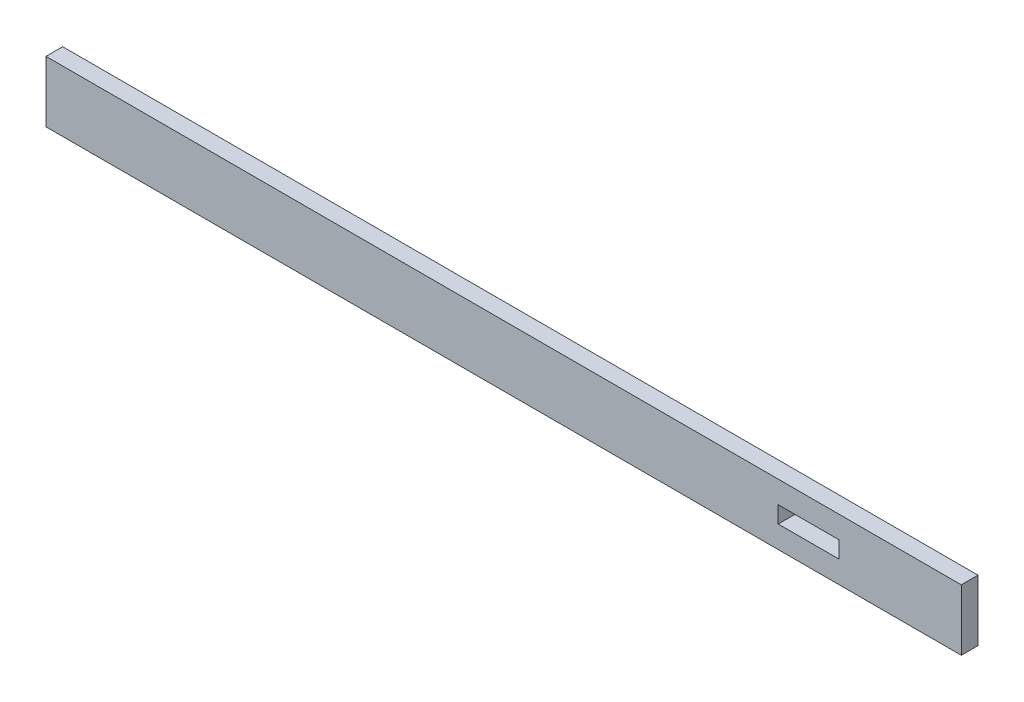
ISO-10303-21;
HEADER;
FILE_DESCRIPTION(('STEP AP214'),'2;1');
FILE_NAME('part.step','',(''),(''),'','','');
FILE_SCHEMA(('AUTOMOTIVE_DESIGN { 1 0 10303 214 1 1 1 1 }'));
ENDSEC;
DATA;
#1=APPLICATION_CONTEXT('core data for automotive mechanical design processes');
#2=APPLICATION_PROTOCOL_DEFINITION('international standard','automotive_design',2000,#1);
#3=PRODUCT_CONTEXT('',#1,'mechanical');
#4=PRODUCT('Part','Part','',(#3));
#5=PRODUCT_RELATED_PRODUCT_CATEGORY('part','',(#4));
#6=PRODUCT_DEFINITION_FORMATION('','',#4);
#7=PRODUCT_DEFINITION_CONTEXT('part definition',#1,'design');
#8=PRODUCT_DEFINITION('design','',#6,#7);
#9=PRODUCT_DEFINITION_SHAPE('','',#8);
#10=(LENGTH_UNIT() NAMED_UNIT(*) SI_UNIT(.MILLI.,.METRE.));
#11=(NAMED_UNIT(*) PLANE_ANGLE_UNIT() SI_UNIT($,.RADIAN.));
#12=(NAMED_UNIT(*) SI_UNIT($,.STERADIAN.) SOLID_ANGLE_UNIT());
#13=UNCERTAINTY_MEASURE_WITH_UNIT(LENGTH_MEASURE(1.E-05),#10,'distance_accuracy_value','');
#14=(GEOMETRIC_REPRESENTATION_CONTEXT(3) GLOBAL_UNCERTAINTY_ASSIGNED_CONTEXT((#13)) GLOBAL_UNIT_ASSIGNED_CONTEXT((#10,
#11,#12)) REPRESENTATION_CONTEXT('',''));
#15=CARTESIAN_POINT('',(0.,0.,0.));
#16=DIRECTION('',(0.,0.,1.));
#17=DIRECTION('',(1.,0.,0.));
#18=AXIS2_PLACEMENT_3D('',#15,#16,#17);
#19=CARTESIAN_POINT('',(0.,0.,2.74));
#20=DIRECTION('',(0.,0.,-1.));
#21=DIRECTION('',(-1.,0.,0.));
#22=AXIS2_PLACEMENT_3D('',#19,#20,#21);
#23=PLANE('',#22);
#24=DIRECTION('',(1.,0.,0.));
#25=VECTOR('',#24,1.);
#26=CARTESIAN_POINT('',(0.,0.,2.74));
#27=LINE('',#26,#25);
#28=CARTESIAN_POINT('',(-150.,0.,2.74));
#29=VERTEX_POINT('',#28);
#30=CARTESIAN_POINT('',(0.,0.,2.74));
#31=VERTEX_POINT('',#30);
#32=EDGE_CURVE('E140',#29,#31,#27,.T.);
#33=ORIENTED_EDGE('',*,*,#32,.T.);
#34=DIRECTION('',(0.,1.,0.));
#35=VECTOR('',#34,1.);
#36=CARTESIAN_POINT('',(0.,0.,2.74));
#37=LINE('',#36,#35);
#38=CARTESIAN_POINT('',(0.,10.,2.74));
#39=VERTEX_POINT('',#38);
#40=EDGE_CURVE('E141',#31,#39,#37,.T.);
#41=ORIENTED_EDGE('',*,*,#40,.T.);
#42=DIRECTION('',(-1.,0.,0.));
#43=VECTOR('',#42,1.);
#44=CARTESIAN_POINT('',(0.,10.,2.74));
#45=LINE('',#44,#43);
#46=CARTESIAN_POINT('',(-150.,9.99999999999996,2.74));
#47=VERTEX_POINT('',#46);
#48=EDGE_CURVE('E148',#39,#47,#45,.T.);
#49=ORIENTED_EDGE('',*,*,#48,.T.);
#50=DIRECTION('',(0.,-1.,0.));
#51=VECTOR('',#50,1.);
#52=CARTESIAN_POINT('',(-150.,0.,2.74));
#53=LINE('',#52,#51);
#54=EDGE_CURVE('E146',#47,#29,#53,.T.);
#55=ORIENTED_EDGE('',*,*,#54,.T.);
#56=EDGE_LOOP('',(#33,#41,#49,#55));
#57=FACE_BOUND('',#56,.T.);
#58=DIRECTION('',(-1.,0.,0.));
#59=VECTOR('',#58,1.);
#60=CARTESIAN_POINT('',(-30.,6.36999999999999,2.74));
#61=LINE('',#60,#59);
#62=CARTESIAN_POINT('',(-20.,6.36999999999999,2.74));
#63=VERTEX_POINT('',#62);
#64=CARTESIAN_POINT('',(-30.,6.36999999999999,2.74));
#65=VERTEX_POINT('',#64);
#66=EDGE_CURVE('E102',#63,#65,#61,.T.);
#67=ORIENTED_EDGE('',*,*,#66,.F.);
#68=DIRECTION('',(0.,1.,0.));
#69=VECTOR('',#68,1.);
#70=CARTESIAN_POINT('',(-20.,3.62999999999999,2.74));
#71=LINE('',#70,#69);
#72=CARTESIAN_POINT('',(-20.,3.62999999999999,2.74));
#73=VERTEX_POINT('',#72);
#74=EDGE_CURVE('E127',#73,#63,#71,.T.);
#75=ORIENTED_EDGE('',*,*,#74,.F.);
#76=DIRECTION('',(1.,0.,0.));
#77=VECTOR('',#76,1.);
#78=CARTESIAN_POINT('',(-30.,3.62999999999999,2.74));
#79=LINE('',#78,#77);
#80=CARTESIAN_POINT('',(-30.,3.62999999999999,2.74));
#81=VERTEX_POINT('',#80);
#82=EDGE_CURVE('E123',#81,#73,#79,.T.);
#83=ORIENTED_EDGE('',*,*,#82,.F.);
#84=DIRECTION('',(0.,-1.,0.));
#85=VECTOR('',#84,1.);
#86=CARTESIAN_POINT('',(-30.,3.62999999999999,2.74));
#87=LINE('',#86,#85);
#88=EDGE_CURVE('E115',#65,#81,#87,.T.);
#89=ORIENTED_EDGE('',*,*,#88,.F.);
#90=EDGE_LOOP('',(#67,#75,#83,#89));
#91=FACE_BOUND('',#90,.T.);
#92=ADVANCED_FACE('F39',(#57,#91),#23,.F.);
#93=CARTESIAN_POINT('',(0.,0.,0.));
#94=DIRECTION('',(0.,0.,-1.));
#95=DIRECTION('',(-1.,0.,0.));
#96=AXIS2_PLACEMENT_3D('',#93,#94,#95);
#97=PLANE('',#96);
#98=DIRECTION('',(1.,0.,0.));
#99=VECTOR('',#98,1.);
#100=CARTESIAN_POINT('',(0.,0.,0.));
#101=LINE('',#100,#99);
#102=CARTESIAN_POINT('',(-150.,0.,0.));
#103=VERTEX_POINT('',#102);
#104=CARTESIAN_POINT('',(0.,0.,0.));
#105=VERTEX_POINT('',#104);
#106=EDGE_CURVE('E119',#103,#105,#101,.T.);
#107=ORIENTED_EDGE('',*,*,#106,.F.);
#108=DIRECTION('',(0.,-1.,0.));
#109=VECTOR('',#108,1.);
#110=CARTESIAN_POINT('',(-150.,0.,0.));
#111=LINE('',#110,#109);
#112=CARTESIAN_POINT('',(-150.,9.99999999999996,0.));
#113=VERTEX_POINT('',#112);
#114=EDGE_CURVE('E145',#113,#103,#111,.T.);
#115=ORIENTED_EDGE('',*,*,#114,.F.);
#116=DIRECTION('',(-1.,0.,0.));
#117=VECTOR('',#116,1.);
#118=CARTESIAN_POINT('',(0.,10.,0.));
#119=LINE('',#118,#117);
#120=CARTESIAN_POINT('',(0.,10.,0.));
#121=VERTEX_POINT('',#120);
#122=EDGE_CURVE('E154',#121,#113,#119,.T.);
#123=ORIENTED_EDGE('',*,*,#122,.F.);
#124=DIRECTION('',(0.,1.,0.));
#125=VECTOR('',#124,1.);
#126=CARTESIAN_POINT('',(0.,0.,0.));
#127=LINE('',#126,#125);
#128=EDGE_CURVE('E153',#105,#121,#127,.T.);
#129=ORIENTED_EDGE('',*,*,#128,.F.);
#130=EDGE_LOOP('',(#107,#115,#123,#129));
#131=FACE_BOUND('',#130,.T.);
#132=DIRECTION('',(0.,1.,0.));
#133=VECTOR('',#132,1.);
#134=CARTESIAN_POINT('',(-20.,3.62999999999999,0.));
#135=LINE('',#134,#133);
#136=CARTESIAN_POINT('',(-20.,3.62999999999999,0.));
#137=VERTEX_POINT('',#136);
#138=CARTESIAN_POINT('',(-20.,6.36999999999999,0.));
#139=VERTEX_POINT('',#138);
#140=EDGE_CURVE('E114',#137,#139,#135,.T.);
#141=ORIENTED_EDGE('',*,*,#140,.T.);
#142=DIRECTION('',(-1.,0.,0.));
#143=VECTOR('',#142,1.);
#144=CARTESIAN_POINT('',(-30.,6.36999999999999,0.));
#145=LINE('',#144,#143);
#146=CARTESIAN_POINT('',(-30.,6.36999999999999,0.));
#147=VERTEX_POINT('',#146);
#148=EDGE_CURVE('E65',#139,#147,#145,.T.);
#149=ORIENTED_EDGE('',*,*,#148,.T.);
#150=DIRECTION('',(0.,-1.,0.));
#151=VECTOR('',#150,1.);
#152=CARTESIAN_POINT('',(-30.,3.62999999999999,0.));
#153=LINE('',#152,#151);
#154=CARTESIAN_POINT('',(-30.,3.62999999999999,0.));
#155=VERTEX_POINT('',#154);
#156=EDGE_CURVE('E118',#147,#155,#153,.T.);
#157=ORIENTED_EDGE('',*,*,#156,.T.);
#158=DIRECTION('',(1.,0.,0.));
#159=VECTOR('',#158,1.);
#160=CARTESIAN_POINT('',(-30.,3.62999999999999,0.));
#161=LINE('',#160,#159);
#162=EDGE_CURVE('E135',#155,#137,#161,.T.);
#163=ORIENTED_EDGE('',*,*,#162,.T.);
#164=EDGE_LOOP('',(#141,#149,#157,#163));
#165=FACE_BOUND('',#164,.T.);
#166=ADVANCED_FACE('F172',(#131,#165),#97,.T.);
#167=CARTESIAN_POINT('',(0.,0.,2.74));
#168=DIRECTION('',(0.,1.,0.));
#169=DIRECTION('',(0.,0.,1.));
#170=AXIS2_PLACEMENT_3D('',#167,#168,#169);
#171=PLANE('',#170);
#172=ORIENTED_EDGE('',*,*,#106,.T.);
#173=DIRECTION('',(0.,0.,-1.));
#174=VECTOR('',#173,1.);
#175=CARTESIAN_POINT('',(0.,0.,2.74));
#176=LINE('',#175,#174);
#177=EDGE_CURVE('E11',#31,#105,#176,.T.);
#178=ORIENTED_EDGE('',*,*,#177,.F.);
#179=ORIENTED_EDGE('',*,*,#32,.F.);
#180=DIRECTION('',(0.,0.,-1.));
#181=VECTOR('',#180,1.);
#182=CARTESIAN_POINT('',(-150.,0.,2.74));
#183=LINE('',#182,#181);
#184=EDGE_CURVE('E147',#29,#103,#183,.T.);
#185=ORIENTED_EDGE('',*,*,#184,.T.);
#186=EDGE_LOOP('',(#172,#178,#179,#185));
#187=FACE_BOUND('',#186,.T.);
#188=ADVANCED_FACE('F41',(#187),#171,.F.);
#189=CARTESIAN_POINT('',(0.,0.,2.74));
#190=DIRECTION('',(-1.,0.,0.));
#191=DIRECTION('',(0.,-1.,0.));
#192=AXIS2_PLACEMENT_3D('',#189,#190,#191);
#193=PLANE('',#192);
#194=ORIENTED_EDGE('',*,*,#128,.T.);
#195=DIRECTION('',(0.,0.,-1.));
#196=VECTOR('',#195,1.);
#197=CARTESIAN_POINT('',(0.,10.,2.74));
#198=LINE('',#197,#196);
#199=EDGE_CURVE('E50',#39,#121,#198,.T.);
#200=ORIENTED_EDGE('',*,*,#199,.F.);
#201=ORIENTED_EDGE('',*,*,#40,.F.);
#202=ORIENTED_EDGE('',*,*,#177,.T.);
#203=EDGE_LOOP('',(#194,#200,#201,#202));
#204=FACE_BOUND('',#203,.T.);
#205=ADVANCED_FACE('F181',(#204),#193,.F.);
#206=CARTESIAN_POINT('',(0.,10.,2.74));
#207=DIRECTION('',(0.,-1.,0.));
#208=DIRECTION('',(1.,0.,0.));
#209=AXIS2_PLACEMENT_3D('',#206,#207,#208);
#210=PLANE('',#209);
#211=ORIENTED_EDGE('',*,*,#122,.T.);
#212=DIRECTION('',(0.,0.,-1.));
#213=VECTOR('',#212,1.);
#214=CARTESIAN_POINT('',(-150.,9.99999999999996,2.74));
#215=LINE('',#214,#213);
#216=EDGE_CURVE('E159',#47,#113,#215,.T.);
#217=ORIENTED_EDGE('',*,*,#216,.F.);
#218=ORIENTED_EDGE('',*,*,#48,.F.);
#219=ORIENTED_EDGE('',*,*,#199,.T.);
#220=EDGE_LOOP('',(#211,#217,#218,#219));
#221=FACE_BOUND('',#220,.T.);
#222=ADVANCED_FACE('F170',(#221),#210,.F.);
#223=CARTESIAN_POINT('',(-150.,0.,2.74));
#224=DIRECTION('',(1.,0.,0.));
#225=DIRECTION('',(0.,0.,-1.));
#226=AXIS2_PLACEMENT_3D('',#223,#224,#225);
#227=PLANE('',#226);
#228=ORIENTED_EDGE('',*,*,#114,.T.);
#229=ORIENTED_EDGE('',*,*,#184,.F.);
#230=ORIENTED_EDGE('',*,*,#54,.F.);
#231=ORIENTED_EDGE('',*,*,#216,.T.);
#232=EDGE_LOOP('',(#228,#229,#230,#231));
#233=FACE_BOUND('',#232,.T.);
#234=ADVANCED_FACE('F177',(#233),#227,.F.);
#235=CARTESIAN_POINT('',(-30.,6.36999999999999,2.74));
#236=DIRECTION('',(0.,-1.,0.));
#237=DIRECTION('',(1.,0.,0.));
#238=AXIS2_PLACEMENT_3D('',#235,#236,#237);
#239=PLANE('',#238);
#240=ORIENTED_EDGE('',*,*,#148,.F.);
#241=DIRECTION('',(0.,0.,-1.));
#242=VECTOR('',#241,1.);
#243=CARTESIAN_POINT('',(-20.,6.36999999999999,2.74));
#244=LINE('',#243,#242);
#245=EDGE_CURVE('E107',#63,#139,#244,.T.);
#246=ORIENTED_EDGE('',*,*,#245,.F.);
#247=ORIENTED_EDGE('',*,*,#66,.T.);
#248=DIRECTION('',(0.,0.,-1.));
#249=VECTOR('',#248,1.);
#250=CARTESIAN_POINT('',(-30.,6.36999999999999,2.74));
#251=LINE('',#250,#249);
#252=EDGE_CURVE('E110',#65,#147,#251,.T.);
#253=ORIENTED_EDGE('',*,*,#252,.T.);
#254=EDGE_LOOP('',(#240,#246,#247,#253));
#255=FACE_BOUND('',#254,.T.);
#256=ADVANCED_FACE('F106',(#255),#239,.T.);
#257=CARTESIAN_POINT('',(-30.,3.62999999999999,2.74));
#258=DIRECTION('',(1.,0.,0.));
#259=DIRECTION('',(0.,0.,-1.));
#260=AXIS2_PLACEMENT_3D('',#257,#258,#259);
#261=PLANE('',#260);
#262=ORIENTED_EDGE('',*,*,#156,.F.);
#263=ORIENTED_EDGE('',*,*,#252,.F.);
#264=ORIENTED_EDGE('',*,*,#88,.T.);
#265=DIRECTION('',(0.,0.,-1.));
#266=VECTOR('',#265,1.);
#267=CARTESIAN_POINT('',(-30.,3.62999999999999,2.74));
#268=LINE('',#267,#266);
#269=EDGE_CURVE('E121',#81,#155,#268,.T.);
#270=ORIENTED_EDGE('',*,*,#269,.T.);
#271=EDGE_LOOP('',(#262,#263,#264,#270));
#272=FACE_BOUND('',#271,.T.);
#273=ADVANCED_FACE('F116',(#272),#261,.T.);
#274=CARTESIAN_POINT('',(-30.,3.62999999999999,2.74));
#275=DIRECTION('',(0.,1.,0.));
#276=DIRECTION('',(-1.,0.,0.));
#277=AXIS2_PLACEMENT_3D('',#274,#275,#276);
#278=PLANE('',#277);
#279=ORIENTED_EDGE('',*,*,#162,.F.);
#280=ORIENTED_EDGE('',*,*,#269,.F.);
#281=ORIENTED_EDGE('',*,*,#82,.T.);
#282=DIRECTION('',(0.,0.,-1.));
#283=VECTOR('',#282,1.);
#284=CARTESIAN_POINT('',(-20.,3.62999999999999,2.74));
#285=LINE('',#284,#283);
#286=EDGE_CURVE('E53',#73,#137,#285,.T.);
#287=ORIENTED_EDGE('',*,*,#286,.T.);
#288=EDGE_LOOP('',(#279,#280,#281,#287));
#289=FACE_BOUND('',#288,.T.);
#290=ADVANCED_FACE('F206',(#289),#278,.T.);
#291=CARTESIAN_POINT('',(-20.,3.62999999999999,2.74));
#292=DIRECTION('',(-1.,0.,0.));
#293=DIRECTION('',(0.,0.,1.));
#294=AXIS2_PLACEMENT_3D('',#291,#292,#293);
#295=PLANE('',#294);
#296=ORIENTED_EDGE('',*,*,#140,.F.);
#297=ORIENTED_EDGE('',*,*,#286,.F.);
#298=ORIENTED_EDGE('',*,*,#74,.T.);
#299=ORIENTED_EDGE('',*,*,#245,.T.);
#300=EDGE_LOOP('',(#296,#297,#298,#299));
#301=FACE_BOUND('',#300,.T.);
#302=ADVANCED_FACE('F209',(#301),#295,.T.);
#303=CLOSED_SHELL('',(#92,#166,#188,#205,#222,#234,#256,#273,#290,#302));
#304=MANIFOLD_SOLID_BREP('B2',#303);
#305=ADVANCED_BREP_SHAPE_REPRESENTATION('',(#18,#304),#14);
#306=SHAPE_DEFINITION_REPRESENTATION(#9,#305);
ENDSEC;
END-ISO-10303-21;
